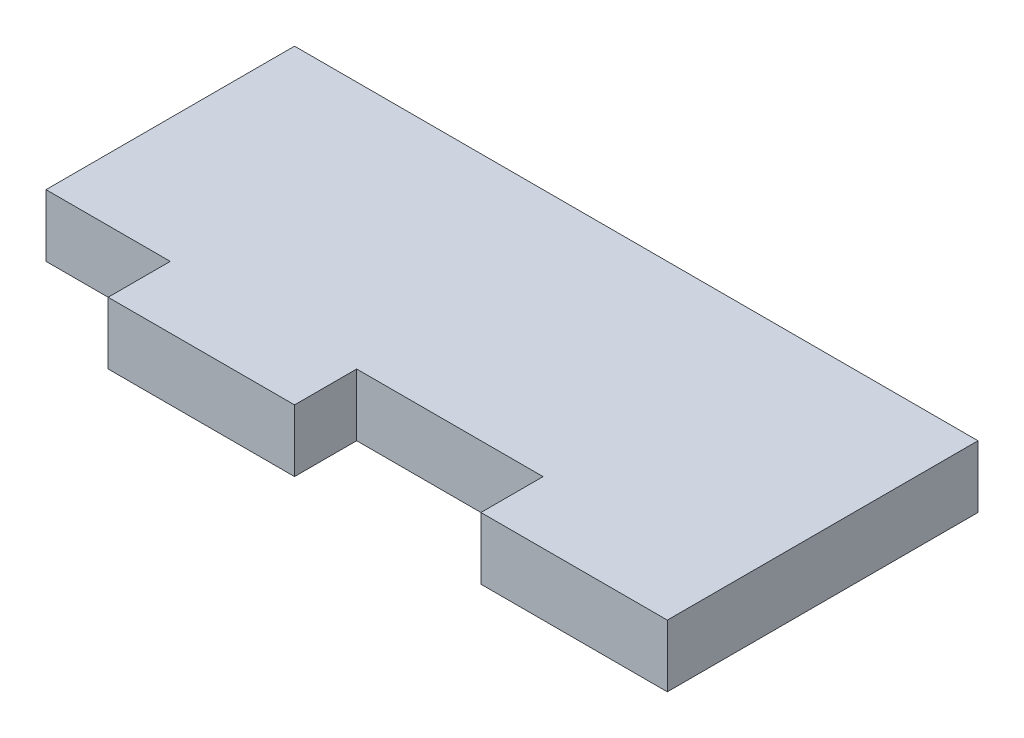
ISO-10303-21;
HEADER;
FILE_DESCRIPTION(('STEP AP214'),'2;1');
FILE_NAME('part.step','',(''),(''),'','','');
FILE_SCHEMA(('AUTOMOTIVE_DESIGN { 1 0 10303 214 1 1 1 1 }'));
ENDSEC;
DATA;
#1=APPLICATION_CONTEXT('core data for automotive mechanical design processes');
#2=APPLICATION_PROTOCOL_DEFINITION('international standard','automotive_design',2000,#1);
#3=PRODUCT_CONTEXT('',#1,'mechanical');
#4=PRODUCT('Part','Part','',(#3));
#5=PRODUCT_RELATED_PRODUCT_CATEGORY('part','',(#4));
#6=PRODUCT_DEFINITION_FORMATION('','',#4);
#7=PRODUCT_DEFINITION_CONTEXT('part definition',#1,'design');
#8=PRODUCT_DEFINITION('design','',#6,#7);
#9=PRODUCT_DEFINITION_SHAPE('','',#8);
#10=(LENGTH_UNIT() NAMED_UNIT(*) SI_UNIT(.MILLI.,.METRE.));
#11=(NAMED_UNIT(*) PLANE_ANGLE_UNIT() SI_UNIT($,.RADIAN.));
#12=(NAMED_UNIT(*) SI_UNIT($,.STERADIAN.) SOLID_ANGLE_UNIT());
#13=UNCERTAINTY_MEASURE_WITH_UNIT(LENGTH_MEASURE(1.E-05),#10,'distance_accuracy_value','');
#14=(GEOMETRIC_REPRESENTATION_CONTEXT(3) GLOBAL_UNCERTAINTY_ASSIGNED_CONTEXT((#13)) GLOBAL_UNIT_ASSIGNED_CONTEXT((#10,
#11,#12)) REPRESENTATION_CONTEXT('',''));
#15=CARTESIAN_POINT('',(0.,0.,0.));
#16=DIRECTION('',(0.,0.,1.));
#17=DIRECTION('',(1.,0.,0.));
#18=AXIS2_PLACEMENT_3D('',#15,#16,#17);
#19=CARTESIAN_POINT('',(-69.85,6.35,0.));
#20=DIRECTION('',(1.,0.,0.));
#21=DIRECTION('',(0.,0.,-1.));
#22=AXIS2_PLACEMENT_3D('',#19,#20,#21);
#23=PLANE('',#22);
#24=DIRECTION('',(0.,0.,1.));
#25=VECTOR('',#24,1.);
#26=CARTESIAN_POINT('',(-69.85,0.,0.));
#27=LINE('',#26,#25);
#28=CARTESIAN_POINT('',(-69.85,0.,-25.4));
#29=VERTEX_POINT('',#28);
#30=CARTESIAN_POINT('',(-69.85,0.,0.));
#31=VERTEX_POINT('',#30);
#32=EDGE_CURVE('E152',#29,#31,#27,.T.);
#33=ORIENTED_EDGE('',*,*,#32,.T.);
#34=DIRECTION('',(0.,-1.,0.));
#35=VECTOR('',#34,1.);
#36=CARTESIAN_POINT('',(-69.85,6.35,0.));
#37=LINE('',#36,#35);
#38=CARTESIAN_POINT('',(-69.85,6.35,0.));
#39=VERTEX_POINT('',#38);
#40=EDGE_CURVE('E11',#39,#31,#37,.T.);
#41=ORIENTED_EDGE('',*,*,#40,.F.);
#42=DIRECTION('',(0.,0.,1.));
#43=VECTOR('',#42,1.);
#44=CARTESIAN_POINT('',(-69.85,6.35,0.));
#45=LINE('',#44,#43);
#46=CARTESIAN_POINT('',(-69.85,6.35,-25.4));
#47=VERTEX_POINT('',#46);
#48=EDGE_CURVE('E180',#47,#39,#45,.T.);
#49=ORIENTED_EDGE('',*,*,#48,.F.);
#50=DIRECTION('',(0.,-1.,0.));
#51=VECTOR('',#50,1.);
#52=CARTESIAN_POINT('',(-69.85,6.35,-25.4));
#53=LINE('',#52,#51);
#54=EDGE_CURVE('E148',#47,#29,#53,.T.);
#55=ORIENTED_EDGE('',*,*,#54,.T.);
#56=EDGE_LOOP('',(#33,#41,#49,#55));
#57=FACE_BOUND('',#56,.T.);
#58=ADVANCED_FACE('F39',(#57),#23,.F.);
#59=CARTESIAN_POINT('',(-57.15,6.35,0.));
#60=DIRECTION('',(0.,0.,-1.));
#61=DIRECTION('',(-1.,0.,0.));
#62=AXIS2_PLACEMENT_3D('',#59,#60,#61);
#63=PLANE('',#62);
#64=DIRECTION('',(1.,0.,0.));
#65=VECTOR('',#64,1.);
#66=CARTESIAN_POINT('',(-57.15,0.,0.));
#67=LINE('',#66,#65);
#68=CARTESIAN_POINT('',(-57.15,0.,0.));
#69=VERTEX_POINT('',#68);
#70=EDGE_CURVE('E156',#31,#69,#67,.T.);
#71=ORIENTED_EDGE('',*,*,#70,.T.);
#72=DIRECTION('',(0.,-1.,0.));
#73=VECTOR('',#72,1.);
#74=CARTESIAN_POINT('',(-57.15,6.35,0.));
#75=LINE('',#74,#73);
#76=CARTESIAN_POINT('',(-57.15,6.35,0.));
#77=VERTEX_POINT('',#76);
#78=EDGE_CURVE('E48',#77,#69,#75,.T.);
#79=ORIENTED_EDGE('',*,*,#78,.F.);
#80=DIRECTION('',(1.,0.,0.));
#81=VECTOR('',#80,1.);
#82=CARTESIAN_POINT('',(-57.15,6.35,0.));
#83=LINE('',#82,#81);
#84=EDGE_CURVE('E105',#39,#77,#83,.T.);
#85=ORIENTED_EDGE('',*,*,#84,.F.);
#86=ORIENTED_EDGE('',*,*,#40,.T.);
#87=EDGE_LOOP('',(#71,#79,#85,#86));
#88=FACE_BOUND('',#87,.T.);
#89=ADVANCED_FACE('F244',(#88),#63,.F.);
#90=CARTESIAN_POINT('',(-57.15,6.35,6.35000000000001));
#91=DIRECTION('',(1.,0.,0.));
#92=DIRECTION('',(0.,0.,-1.));
#93=AXIS2_PLACEMENT_3D('',#90,#91,#92);
#94=PLANE('',#93);
#95=DIRECTION('',(0.,0.,1.));
#96=VECTOR('',#95,1.);
#97=CARTESIAN_POINT('',(-57.15,0.,6.35000000000001));
#98=LINE('',#97,#96);
#99=CARTESIAN_POINT('',(-57.15,0.,6.35000000000001));
#100=VERTEX_POINT('',#99);
#101=EDGE_CURVE('E159',#69,#100,#98,.T.);
#102=ORIENTED_EDGE('',*,*,#101,.T.);
#103=DIRECTION('',(0.,-1.,0.));
#104=VECTOR('',#103,1.);
#105=CARTESIAN_POINT('',(-57.15,6.35,6.35000000000001));
#106=LINE('',#105,#104);
#107=CARTESIAN_POINT('',(-57.15,6.35,6.35000000000001));
#108=VERTEX_POINT('',#107);
#109=EDGE_CURVE('E199',#108,#100,#106,.T.);
#110=ORIENTED_EDGE('',*,*,#109,.F.);
#111=DIRECTION('',(0.,0.,1.));
#112=VECTOR('',#111,1.);
#113=CARTESIAN_POINT('',(-57.15,6.35,6.35000000000001));
#114=LINE('',#113,#112);
#115=EDGE_CURVE('E209',#77,#108,#114,.T.);
#116=ORIENTED_EDGE('',*,*,#115,.F.);
#117=ORIENTED_EDGE('',*,*,#78,.T.);
#118=EDGE_LOOP('',(#102,#110,#116,#117));
#119=FACE_BOUND('',#118,.T.);
#120=ADVANCED_FACE('F207',(#119),#94,.F.);
#121=CARTESIAN_POINT('',(-38.1,6.35,6.35));
#122=DIRECTION('',(0.,0.,-1.));
#123=DIRECTION('',(-1.,0.,0.));
#124=AXIS2_PLACEMENT_3D('',#121,#122,#123);
#125=PLANE('',#124);
#126=DIRECTION('',(1.,0.,0.));
#127=VECTOR('',#126,1.);
#128=CARTESIAN_POINT('',(-38.1,0.,6.35));
#129=LINE('',#128,#127);
#130=CARTESIAN_POINT('',(-38.1,0.,6.35));
#131=VERTEX_POINT('',#130);
#132=EDGE_CURVE('E162',#100,#131,#129,.T.);
#133=ORIENTED_EDGE('',*,*,#132,.T.);
#134=DIRECTION('',(0.,-1.,0.));
#135=VECTOR('',#134,1.);
#136=CARTESIAN_POINT('',(-38.1,6.35,6.35));
#137=LINE('',#136,#135);
#138=CARTESIAN_POINT('',(-38.1,6.35,6.35));
#139=VERTEX_POINT('',#138);
#140=EDGE_CURVE('E195',#139,#131,#137,.T.);
#141=ORIENTED_EDGE('',*,*,#140,.F.);
#142=DIRECTION('',(1.,0.,0.));
#143=VECTOR('',#142,1.);
#144=CARTESIAN_POINT('',(-38.1,6.35,6.35));
#145=LINE('',#144,#143);
#146=EDGE_CURVE('E228',#108,#139,#145,.T.);
#147=ORIENTED_EDGE('',*,*,#146,.F.);
#148=ORIENTED_EDGE('',*,*,#109,.T.);
#149=EDGE_LOOP('',(#133,#141,#147,#148));
#150=FACE_BOUND('',#149,.T.);
#151=ADVANCED_FACE('F218',(#150),#125,.F.);
#152=CARTESIAN_POINT('',(-38.1,6.35,0.));
#153=DIRECTION('',(-1.,0.,0.));
#154=DIRECTION('',(0.,0.,1.));
#155=AXIS2_PLACEMENT_3D('',#152,#153,#154);
#156=PLANE('',#155);
#157=DIRECTION('',(0.,0.,-1.));
#158=VECTOR('',#157,1.);
#159=CARTESIAN_POINT('',(-38.1,0.,0.));
#160=LINE('',#159,#158);
#161=CARTESIAN_POINT('',(-38.1,0.,0.));
#162=VERTEX_POINT('',#161);
#163=EDGE_CURVE('E165',#131,#162,#160,.T.);
#164=ORIENTED_EDGE('',*,*,#163,.T.);
#165=DIRECTION('',(0.,-1.,0.));
#166=VECTOR('',#165,1.);
#167=CARTESIAN_POINT('',(-38.1,6.35,0.));
#168=LINE('',#167,#166);
#169=CARTESIAN_POINT('',(-38.1,6.35,0.));
#170=VERTEX_POINT('',#169);
#171=EDGE_CURVE('E191',#170,#162,#168,.T.);
#172=ORIENTED_EDGE('',*,*,#171,.F.);
#173=DIRECTION('',(0.,0.,-1.));
#174=VECTOR('',#173,1.);
#175=CARTESIAN_POINT('',(-38.1,6.35,0.));
#176=LINE('',#175,#174);
#177=EDGE_CURVE('E224',#139,#170,#176,.T.);
#178=ORIENTED_EDGE('',*,*,#177,.F.);
#179=ORIENTED_EDGE('',*,*,#140,.T.);
#180=EDGE_LOOP('',(#164,#172,#178,#179));
#181=FACE_BOUND('',#180,.T.);
#182=ADVANCED_FACE('F222',(#181),#156,.F.);
#183=CARTESIAN_POINT('',(-19.05,6.35,0.));
#184=DIRECTION('',(0.,0.,-1.));
#185=DIRECTION('',(-1.,0.,0.));
#186=AXIS2_PLACEMENT_3D('',#183,#184,#185);
#187=PLANE('',#186);
#188=DIRECTION('',(1.,0.,0.));
#189=VECTOR('',#188,1.);
#190=CARTESIAN_POINT('',(-19.05,0.,0.));
#191=LINE('',#190,#189);
#192=CARTESIAN_POINT('',(-19.05,0.,0.));
#193=VERTEX_POINT('',#192);
#194=EDGE_CURVE('E168',#162,#193,#191,.T.);
#195=ORIENTED_EDGE('',*,*,#194,.T.);
#196=DIRECTION('',(0.,-1.,0.));
#197=VECTOR('',#196,1.);
#198=CARTESIAN_POINT('',(-19.05,6.35,0.));
#199=LINE('',#198,#197);
#200=CARTESIAN_POINT('',(-19.05,6.35,0.));
#201=VERTEX_POINT('',#200);
#202=EDGE_CURVE('E187',#201,#193,#199,.T.);
#203=ORIENTED_EDGE('',*,*,#202,.F.);
#204=DIRECTION('',(1.,0.,0.));
#205=VECTOR('',#204,1.);
#206=CARTESIAN_POINT('',(-19.05,6.35,0.));
#207=LINE('',#206,#205);
#208=EDGE_CURVE('E227',#170,#201,#207,.T.);
#209=ORIENTED_EDGE('',*,*,#208,.F.);
#210=ORIENTED_EDGE('',*,*,#171,.T.);
#211=EDGE_LOOP('',(#195,#203,#209,#210));
#212=FACE_BOUND('',#211,.T.);
#213=ADVANCED_FACE('F256',(#212),#187,.F.);
#214=CARTESIAN_POINT('',(-19.05,6.35,6.35));
#215=DIRECTION('',(1.,0.,0.));
#216=DIRECTION('',(0.,0.,-1.));
#217=AXIS2_PLACEMENT_3D('',#214,#215,#216);
#218=PLANE('',#217);
#219=DIRECTION('',(0.,0.,1.));
#220=VECTOR('',#219,1.);
#221=CARTESIAN_POINT('',(-19.05,0.,6.35));
#222=LINE('',#221,#220);
#223=CARTESIAN_POINT('',(-19.05,0.,6.35));
#224=VERTEX_POINT('',#223);
#225=EDGE_CURVE('E171',#193,#224,#222,.T.);
#226=ORIENTED_EDGE('',*,*,#225,.T.);
#227=DIRECTION('',(0.,-1.,0.));
#228=VECTOR('',#227,1.);
#229=CARTESIAN_POINT('',(-19.05,6.35,6.35));
#230=LINE('',#229,#228);
#231=CARTESIAN_POINT('',(-19.05,6.35,6.35));
#232=VERTEX_POINT('',#231);
#233=EDGE_CURVE('E141',#232,#224,#230,.T.);
#234=ORIENTED_EDGE('',*,*,#233,.F.);
#235=DIRECTION('',(0.,0.,1.));
#236=VECTOR('',#235,1.);
#237=CARTESIAN_POINT('',(-19.05,6.35,6.35));
#238=LINE('',#237,#236);
#239=EDGE_CURVE('E130',#201,#232,#238,.T.);
#240=ORIENTED_EDGE('',*,*,#239,.F.);
#241=ORIENTED_EDGE('',*,*,#202,.T.);
#242=EDGE_LOOP('',(#226,#234,#240,#241));
#243=FACE_BOUND('',#242,.T.);
#244=ADVANCED_FACE('F259',(#243),#218,.F.);
#245=CARTESIAN_POINT('',(0.,6.35,6.35));
#246=DIRECTION('',(0.,0.,-1.));
#247=DIRECTION('',(-1.,0.,0.));
#248=AXIS2_PLACEMENT_3D('',#245,#246,#247);
#249=PLANE('',#248);
#250=DIRECTION('',(1.,0.,0.));
#251=VECTOR('',#250,1.);
#252=CARTESIAN_POINT('',(0.,0.,6.35));
#253=LINE('',#252,#251);
#254=CARTESIAN_POINT('',(0.,0.,6.35));
#255=VERTEX_POINT('',#254);
#256=EDGE_CURVE('E139',#224,#255,#253,.T.);
#257=ORIENTED_EDGE('',*,*,#256,.T.);
#258=DIRECTION('',(0.,-1.,0.));
#259=VECTOR('',#258,1.);
#260=CARTESIAN_POINT('',(0.,6.35,6.35));
#261=LINE('',#260,#259);
#262=CARTESIAN_POINT('',(0.,6.35,6.35));
#263=VERTEX_POINT('',#262);
#264=EDGE_CURVE('E136',#263,#255,#261,.T.);
#265=ORIENTED_EDGE('',*,*,#264,.F.);
#266=DIRECTION('',(1.,0.,0.));
#267=VECTOR('',#266,1.);
#268=CARTESIAN_POINT('',(0.,6.35,6.35));
#269=LINE('',#268,#267);
#270=EDGE_CURVE('E124',#232,#263,#269,.T.);
#271=ORIENTED_EDGE('',*,*,#270,.F.);
#272=ORIENTED_EDGE('',*,*,#233,.T.);
#273=EDGE_LOOP('',(#257,#265,#271,#272));
#274=FACE_BOUND('',#273,.T.);
#275=ADVANCED_FACE('F137',(#274),#249,.F.);
#276=CARTESIAN_POINT('',(0.,6.35,-25.4));
#277=DIRECTION('',(-1.,0.,0.));
#278=DIRECTION('',(0.,0.,1.));
#279=AXIS2_PLACEMENT_3D('',#276,#277,#278);
#280=PLANE('',#279);
#281=DIRECTION('',(0.,0.,-1.));
#282=VECTOR('',#281,1.);
#283=CARTESIAN_POINT('',(0.,0.,-25.4));
#284=LINE('',#283,#282);
#285=CARTESIAN_POINT('',(0.,0.,-25.4));
#286=VERTEX_POINT('',#285);
#287=EDGE_CURVE('E91',#255,#286,#284,.T.);
#288=ORIENTED_EDGE('',*,*,#287,.T.);
#289=DIRECTION('',(0.,-1.,0.));
#290=VECTOR('',#289,1.);
#291=CARTESIAN_POINT('',(0.,6.35,-25.4));
#292=LINE('',#291,#290);
#293=CARTESIAN_POINT('',(0.,6.35,-25.4));
#294=VERTEX_POINT('',#293);
#295=EDGE_CURVE('E142',#294,#286,#292,.T.);
#296=ORIENTED_EDGE('',*,*,#295,.F.);
#297=DIRECTION('',(0.,0.,-1.));
#298=VECTOR('',#297,1.);
#299=CARTESIAN_POINT('',(0.,6.35,-25.4));
#300=LINE('',#299,#298);
#301=EDGE_CURVE('E128',#263,#294,#300,.T.);
#302=ORIENTED_EDGE('',*,*,#301,.F.);
#303=ORIENTED_EDGE('',*,*,#264,.T.);
#304=EDGE_LOOP('',(#288,#296,#302,#303));
#305=FACE_BOUND('',#304,.T.);
#306=ADVANCED_FACE('F144',(#305),#280,.F.);
#307=CARTESIAN_POINT('',(-69.85,6.35,-25.4));
#308=DIRECTION('',(0.,0.,1.));
#309=DIRECTION('',(1.,0.,0.));
#310=AXIS2_PLACEMENT_3D('',#307,#308,#309);
#311=PLANE('',#310);
#312=DIRECTION('',(-1.,0.,0.));
#313=VECTOR('',#312,1.);
#314=CARTESIAN_POINT('',(-69.85,0.,-25.4));
#315=LINE('',#314,#313);
#316=EDGE_CURVE('E97',#286,#29,#315,.T.);
#317=ORIENTED_EDGE('',*,*,#316,.T.);
#318=ORIENTED_EDGE('',*,*,#54,.F.);
#319=DIRECTION('',(-1.,0.,0.));
#320=VECTOR('',#319,1.);
#321=CARTESIAN_POINT('',(-69.85,6.35,-25.4));
#322=LINE('',#321,#320);
#323=EDGE_CURVE('E56',#294,#47,#322,.T.);
#324=ORIENTED_EDGE('',*,*,#323,.F.);
#325=ORIENTED_EDGE('',*,*,#295,.T.);
#326=EDGE_LOOP('',(#317,#318,#324,#325));
#327=FACE_BOUND('',#326,.T.);
#328=ADVANCED_FACE('F268',(#327),#311,.F.);
#329=CARTESIAN_POINT('',(0.,6.35,0.));
#330=DIRECTION('',(0.,-1.,0.));
#331=DIRECTION('',(0.,0.,-1.));
#332=AXIS2_PLACEMENT_3D('',#329,#330,#331);
#333=PLANE('',#332);
#334=ORIENTED_EDGE('',*,*,#48,.T.);
#335=ORIENTED_EDGE('',*,*,#84,.T.);
#336=ORIENTED_EDGE('',*,*,#115,.T.);
#337=ORIENTED_EDGE('',*,*,#146,.T.);
#338=ORIENTED_EDGE('',*,*,#177,.T.);
#339=ORIENTED_EDGE('',*,*,#208,.T.);
#340=ORIENTED_EDGE('',*,*,#239,.T.);
#341=ORIENTED_EDGE('',*,*,#270,.T.);
#342=ORIENTED_EDGE('',*,*,#301,.T.);
#343=ORIENTED_EDGE('',*,*,#323,.T.);
#344=EDGE_LOOP('',(#334,#335,#336,#337,#338,#339,#340,#341,#342,#343));
#345=FACE_BOUND('',#344,.T.);
#346=ADVANCED_FACE('F126',(#345),#333,.F.);
#347=CARTESIAN_POINT('',(0.,0.,0.));
#348=DIRECTION('',(0.,-1.,0.));
#349=DIRECTION('',(0.,0.,-1.));
#350=AXIS2_PLACEMENT_3D('',#347,#348,#349);
#351=PLANE('',#350);
#352=ORIENTED_EDGE('',*,*,#32,.F.);
#353=ORIENTED_EDGE('',*,*,#316,.F.);
#354=ORIENTED_EDGE('',*,*,#287,.F.);
#355=ORIENTED_EDGE('',*,*,#256,.F.);
#356=ORIENTED_EDGE('',*,*,#225,.F.);
#357=ORIENTED_EDGE('',*,*,#194,.F.);
#358=ORIENTED_EDGE('',*,*,#163,.F.);
#359=ORIENTED_EDGE('',*,*,#132,.F.);
#360=ORIENTED_EDGE('',*,*,#101,.F.);
#361=ORIENTED_EDGE('',*,*,#70,.F.);
#362=EDGE_LOOP('',(#352,#353,#354,#355,#356,#357,#358,#359,#360,#361));
#363=FACE_BOUND('',#362,.T.);
#364=ADVANCED_FACE('F213',(#363),#351,.T.);
#365=CLOSED_SHELL('',(#58,#89,#120,#151,#182,#213,#244,#275,#306,#328,#346,#364));
#366=MANIFOLD_SOLID_BREP('B2',#365);
#367=ADVANCED_BREP_SHAPE_REPRESENTATION('',(#18,#366),#14);
#368=SHAPE_DEFINITION_REPRESENTATION(#9,#367);
ENDSEC;
END-ISO-10303-21;
